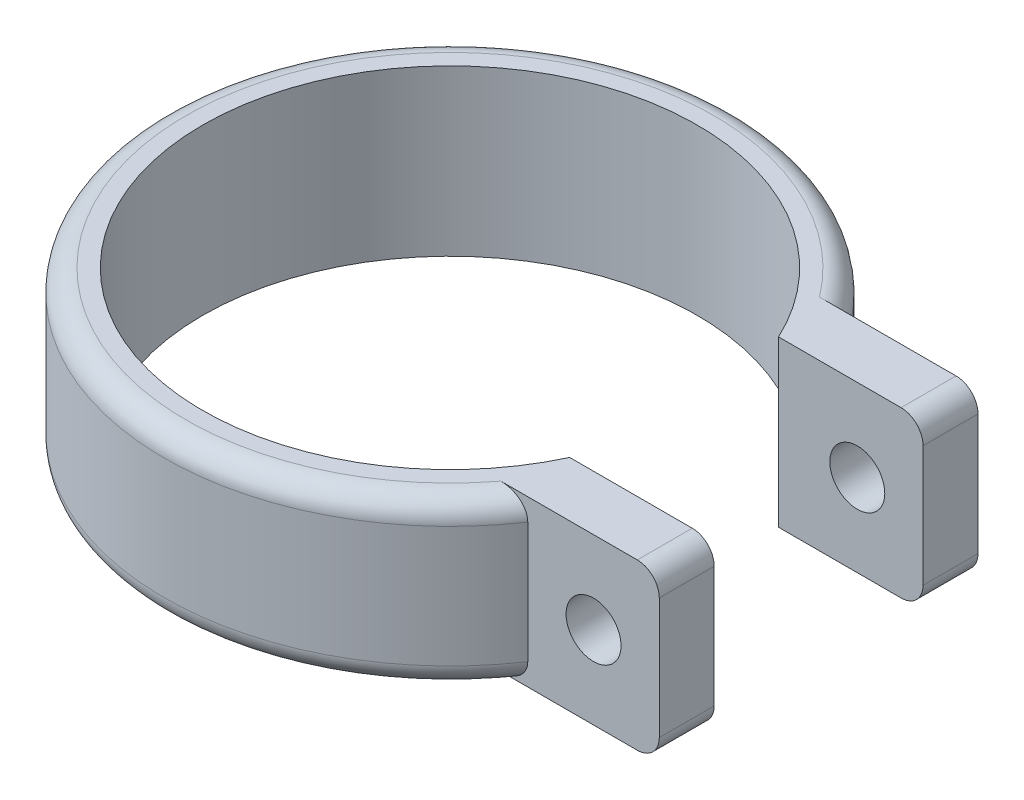
ISO-10303-21;
HEADER;
FILE_DESCRIPTION(('STEP AP214'),'2;1');
FILE_NAME('part.step','',(''),(''),'','','');
FILE_SCHEMA(('AUTOMOTIVE_DESIGN { 1 0 10303 214 1 1 1 1 }'));
ENDSEC;
DATA;
#1=APPLICATION_CONTEXT('core data for automotive mechanical design processes');
#2=APPLICATION_PROTOCOL_DEFINITION('international standard','automotive_design',2000,#1);
#3=PRODUCT_CONTEXT('',#1,'mechanical');
#4=PRODUCT('Part','Part','',(#3));
#5=PRODUCT_RELATED_PRODUCT_CATEGORY('part','',(#4));
#6=PRODUCT_DEFINITION_FORMATION('','',#4);
#7=PRODUCT_DEFINITION_CONTEXT('part definition',#1,'design');
#8=PRODUCT_DEFINITION('design','',#6,#7);
#9=PRODUCT_DEFINITION_SHAPE('','',#8);
#10=(LENGTH_UNIT() NAMED_UNIT(*) SI_UNIT(.MILLI.,.METRE.));
#11=(NAMED_UNIT(*) PLANE_ANGLE_UNIT() SI_UNIT($,.RADIAN.));
#12=(NAMED_UNIT(*) SI_UNIT($,.STERADIAN.) SOLID_ANGLE_UNIT());
#13=UNCERTAINTY_MEASURE_WITH_UNIT(LENGTH_MEASURE(1.E-05),#10,'distance_accuracy_value','');
#14=(GEOMETRIC_REPRESENTATION_CONTEXT(3) GLOBAL_UNCERTAINTY_ASSIGNED_CONTEXT((#13)) GLOBAL_UNIT_ASSIGNED_CONTEXT((#10,
#11,#12)) REPRESENTATION_CONTEXT('',''));
#15=CARTESIAN_POINT('',(0.,0.,0.));
#16=DIRECTION('',(0.,0.,1.));
#17=DIRECTION('',(1.,0.,0.));
#18=AXIS2_PLACEMENT_3D('',#15,#16,#17);
#19=CARTESIAN_POINT('',(33.5473122354776,15.,-9.5));
#20=DIRECTION('',(-1.,0.,0.));
#21=DIRECTION('',(0.,0.,1.));
#22=AXIS2_PLACEMENT_3D('',#19,#20,#21);
#23=PLANE('',#22);
#24=DIRECTION('',(0.,-1.,0.));
#25=VECTOR('',#24,1.);
#26=CARTESIAN_POINT('',(33.5473122354776,15.,-9.5));
#27=LINE('',#26,#25);
#28=CARTESIAN_POINT('',(33.5473122354776,13.,-9.5));
#29=VERTEX_POINT('',#28);
#30=CARTESIAN_POINT('',(33.5473122354776,2.,-9.5));
#31=VERTEX_POINT('',#30);
#32=EDGE_CURVE('E167',#29,#31,#27,.T.);
#33=ORIENTED_EDGE('',*,*,#32,.T.);
#34=DIRECTION('',(0.,0.,-1.));
#35=VECTOR('',#34,1.);
#36=CARTESIAN_POINT('',(33.5473122354776,2.,-9.5));
#37=LINE('',#36,#35);
#38=CARTESIAN_POINT('',(33.5473122354776,2.,-14.5));
#39=VERTEX_POINT('',#38);
#40=EDGE_CURVE('E218',#31,#39,#37,.T.);
#41=ORIENTED_EDGE('',*,*,#40,.T.);
#42=DIRECTION('',(0.,-1.,0.));
#43=VECTOR('',#42,1.);
#44=CARTESIAN_POINT('',(33.5473122354776,15.,-14.5));
#45=LINE('',#44,#43);
#46=CARTESIAN_POINT('',(33.5473122354776,13.,-14.5));
#47=VERTEX_POINT('',#46);
#48=EDGE_CURVE('E194',#47,#39,#45,.T.);
#49=ORIENTED_EDGE('',*,*,#48,.F.);
#50=DIRECTION('',(0.,0.,-1.));
#51=VECTOR('',#50,1.);
#52=CARTESIAN_POINT('',(33.5473122354776,13.,-9.5));
#53=LINE('',#52,#51);
#54=EDGE_CURVE('E216',#47,#29,#53,.F.);
#55=ORIENTED_EDGE('',*,*,#54,.T.);
#56=EDGE_LOOP('',(#33,#41,#49,#55));
#57=FACE_BOUND('',#56,.T.);
#58=ADVANCED_FACE('F36',(#57),#23,.F.);
#59=CARTESIAN_POINT('',(33.5473122354776,15.,-14.5));
#60=DIRECTION('',(0.,0.,1.));
#61=DIRECTION('',(1.,0.,0.));
#62=AXIS2_PLACEMENT_3D('',#59,#60,#61);
#63=PLANE('',#62);
#64=CARTESIAN_POINT('',(27.5642770451924,7.5,-14.5));
#65=DIRECTION('',(0.,0.,1.));
#66=DIRECTION('',(1.,0.,0.));
#67=AXIS2_PLACEMENT_3D('',#64,#65,#66);
#68=CIRCLE('',#67,2.5);
#69=CARTESIAN_POINT('',(30.0642770451924,7.5,-14.5));
#70=VERTEX_POINT('',#69);
#71=EDGE_CURVE('E174',#70,#70,#68,.T.);
#72=ORIENTED_EDGE('',*,*,#71,.T.);
#73=EDGE_LOOP('',(#72));
#74=FACE_BOUND('',#73,.T.);
#75=ORIENTED_EDGE('',*,*,#48,.T.);
#76=CARTESIAN_POINT('',(31.5473122354776,2.,-14.5));
#77=DIRECTION('',(0.,0.,1.));
#78=DIRECTION('',(1.,0.,0.));
#79=AXIS2_PLACEMENT_3D('',#76,#77,#78);
#80=CIRCLE('',#79,2.);
#81=CARTESIAN_POINT('',(31.5473122354776,0.,-14.5));
#82=VERTEX_POINT('',#81);
#83=EDGE_CURVE('E223',#39,#82,#80,.F.);
#84=ORIENTED_EDGE('',*,*,#83,.T.);
#85=DIRECTION('',(-1.,0.,0.));
#86=VECTOR('',#85,1.);
#87=CARTESIAN_POINT('',(33.5473122354776,0.,-14.5));
#88=LINE('',#87,#86);
#89=CARTESIAN_POINT('',(19.1245914989053,0.,-14.5));
#90=VERTEX_POINT('',#89);
#91=EDGE_CURVE('E171',#82,#90,#88,.T.);
#92=ORIENTED_EDGE('',*,*,#91,.T.);
#93=CARTESIAN_POINT('',(19.1245914989053,0.,-14.5));
#94=CARTESIAN_POINT('',(19.2936413375081,8.69825305665832E-06,-14.5));
#95=CARTESIAN_POINT('',(19.4631277610717,0.0136264284760047,-14.5));
#96=CARTESIAN_POINT('',(19.7983868128576,0.0693512299959271,-14.5));
#97=CARTESIAN_POINT('',(19.9641295146833,0.111636286901858,-14.5));
#98=CARTESIAN_POINT('',(20.2540565742359,0.214950087227459,-14.5));
#99=CARTESIAN_POINT('',(20.3800840610994,0.270780158488233,-14.5));
#100=CARTESIAN_POINT('',(20.6211294998245,0.402158003321633,-14.5));
#101=CARTESIAN_POINT('',(20.7361782615013,0.477648239000448,-14.5));
#102=CARTESIAN_POINT('',(20.9327189190862,0.633810739443377,-14.5));
#103=CARTESIAN_POINT('',(21.0165990723592,0.711468957257789,-14.5));
#104=CARTESIAN_POINT('',(21.1705210184579,0.879612413151045,-14.5));
#105=CARTESIAN_POINT('',(21.2405592579776,0.970100934637346,-14.5));
#106=CARTESIAN_POINT('',(21.363789331003,1.16309604843582,-14.5));
#107=CARTESIAN_POINT('',(21.4168480732013,1.26568935309437,-14.5));
#108=CARTESIAN_POINT('',(21.4806689050926,1.42563040242777,-14.5));
#109=CARTESIAN_POINT('',(21.4993110159743,1.47993333400015,-14.5));
#110=CARTESIAN_POINT('',(21.5310676637447,1.59012201195215,-14.5));
#111=CARTESIAN_POINT('',(21.5441855171411,1.64600678709573,-14.5));
#112=CARTESIAN_POINT('',(21.5633171218232,1.75150199722526,-14.5));
#113=CARTESIAN_POINT('',(21.5700312685346,1.80098686311791,-14.5));
#114=CARTESIAN_POINT('',(21.5789966352239,1.90031157715789,-14.5));
#115=CARTESIAN_POINT('',(21.5812520485859,1.95015104747767,-14.5));
#116=CARTESIAN_POINT('',(21.5812418549072,2.,-14.5));
#117=B_SPLINE_CURVE_WITH_KNOTS('',3,(#93,#94,#95,#96,#97,#98,#99,#100,#101,#102,#103,#104,#105,
#106,#107,#108,#109,#110,#111,#112,#113,#114,#115,#116),.UNSPECIFIED.,.F.,.F.,(4,2,2,2,2,2,2,2,
2,2,2,4),(0.,0.507334378331602,1.01784782257652,1.42974389775541,1.84044779620607,
2.18198112251818,2.52360200902193,2.86783853526572,3.03984121582224,3.21174048623355,
3.3613600630725,3.51083885746047),.UNSPECIFIED.);
#118=CARTESIAN_POINT('',(21.5812418549072,2.,-14.5));
#119=VERTEX_POINT('',#118);
#120=EDGE_CURVE('E249',#90,#119,#117,.T.);
#121=ORIENTED_EDGE('',*,*,#120,.T.);
#122=DIRECTION('',(0.,-1.,0.));
#123=VECTOR('',#122,1.);
#124=CARTESIAN_POINT('',(21.5812418549072,15.,-14.5));
#125=LINE('',#124,#123);
#126=CARTESIAN_POINT('',(21.5812418549072,13.,-14.5));
#127=VERTEX_POINT('',#126);
#128=EDGE_CURVE('E191',#127,#119,#125,.T.);
#129=ORIENTED_EDGE('',*,*,#128,.F.);
#130=CARTESIAN_POINT('',(21.5812418549072,13.,-14.5));
#131=CARTESIAN_POINT('',(21.5812525500746,13.0492968800028,-14.5));
#132=CARTESIAN_POINT('',(21.5790463329122,13.0985883969587,-14.5));
#133=CARTESIAN_POINT('',(21.5702820117545,13.1967644295305,-14.5));
#134=CARTESIAN_POINT('',(21.563725594606,13.2456490954716,-14.5));
#135=CARTESIAN_POINT('',(21.5463850895291,13.3424173601148,-14.5));
#136=CARTESIAN_POINT('',(21.5356217792218,13.3903046787,-14.5));
#137=CARTESIAN_POINT('',(21.510027352005,13.4849679647644,-14.5));
#138=CARTESIAN_POINT('',(21.4951960161254,13.5317438722722,-14.5));
#139=CARTESIAN_POINT('',(21.4449114455271,13.6698144300531,-14.5));
#140=CARTESIAN_POINT('',(21.4036308120417,13.7590522628015,-14.5));
#141=CARTESIAN_POINT('',(21.3074853085682,13.9298632480218,-14.5));
#142=CARTESIAN_POINT('',(21.2526069835422,14.0114286976425,-14.5));
#143=CARTESIAN_POINT('',(21.1279036365924,14.1700653889252,-14.5));
#144=CARTESIAN_POINT('',(21.0573926317439,14.2465955550924,-14.5));
#145=CARTESIAN_POINT('',(20.9061395904074,14.3886922473937,-14.5));
#146=CARTESIAN_POINT('',(20.8253946748786,14.4542556762381,-14.5));
#147=CARTESIAN_POINT('',(20.6423884648797,14.5836812191054,-14.5));
#148=CARTESIAN_POINT('',(20.5387512870901,14.6455944461883,-14.5));
#149=CARTESIAN_POINT('',(20.3237901731422,14.7542649040706,-14.5));
#150=CARTESIAN_POINT('',(20.2124588220382,14.8010072603875,-14.5));
#151=CARTESIAN_POINT('',(19.9636235800414,14.8868788486306,-14.5));
#152=CARTESIAN_POINT('',(19.8250852381367,14.9230046209588,-14.5));
#153=CARTESIAN_POINT('',(19.5444454944623,14.9750199736067,-14.5));
#154=CARTESIAN_POINT('',(19.4023480454246,14.9909310694057,-14.5));
#155=CARTESIAN_POINT('',(19.2148392829702,14.9990303879465,-14.5));
#156=CARTESIAN_POINT('',(19.1697064051486,14.999999555181,-14.5));
#157=CARTESIAN_POINT('',(19.1245914989053,15.,-14.5));
#158=B_SPLINE_CURVE_WITH_KNOTS('',3,(#130,#131,#132,#133,#134,#135,#136,#137,#138,#139,#140,
#141,#142,#143,#144,#145,#146,#147,#148,#149,#150,#151,#152,#153,#154,#155,#156,#157),
.UNSPECIFIED.,.F.,.F.,(4,2,2,2,2,2,2,2,2,2,2,2,2,4),(0.,0.147832371466264,0.295607452473689,
0.442661719898438,0.589723904388314,0.883245022394847,1.17705775025786,1.48803814821605,
1.79910622730861,2.15992123152113,2.5210889403756,2.94900412945992,3.37646348465335,
3.51184454973519),.UNSPECIFIED.);
#159=CARTESIAN_POINT('',(19.1245914989053,15.,-14.5));
#160=VERTEX_POINT('',#159);
#161=EDGE_CURVE('E11',#127,#160,#158,.T.);
#162=ORIENTED_EDGE('',*,*,#161,.T.);
#163=DIRECTION('',(-1.,0.,0.));
#164=VECTOR('',#163,1.);
#165=CARTESIAN_POINT('',(33.5473122354776,15.,-14.5));
#166=LINE('',#165,#164);
#167=CARTESIAN_POINT('',(31.5473122354776,15.,-14.5));
#168=VERTEX_POINT('',#167);
#169=EDGE_CURVE('E181',#168,#160,#166,.T.);
#170=ORIENTED_EDGE('',*,*,#169,.F.);
#171=CARTESIAN_POINT('',(31.5473122354776,13.,-14.5));
#172=DIRECTION('',(0.,0.,1.));
#173=DIRECTION('',(1.,0.,0.));
#174=AXIS2_PLACEMENT_3D('',#171,#172,#173);
#175=CIRCLE('',#174,2.);
#176=EDGE_CURVE('E221',#168,#47,#175,.F.);
#177=ORIENTED_EDGE('',*,*,#176,.T.);
#178=EDGE_LOOP('',(#75,#84,#92,#121,#129,#162,#170,#177));
#179=FACE_BOUND('',#178,.T.);
#180=ADVANCED_FACE('F301',(#74,#179),#63,.F.);
#181=CARTESIAN_POINT('',(0.,15.,0.));
#182=DIRECTION('',(0.,-1.,0.));
#183=DIRECTION('',(0.,0.,-1.));
#184=AXIS2_PLACEMENT_3D('',#181,#182,#183);
#185=CYLINDRICAL_SURFACE('',#184,26.);
#186=ORIENTED_EDGE('',*,*,#128,.T.);
#187=CARTESIAN_POINT('',(0.,2.,0.));
#188=DIRECTION('',(0.,1.,0.));
#189=DIRECTION('',(0.,0.,1.));
#190=AXIS2_PLACEMENT_3D('',#187,#188,#189);
#191=CIRCLE('',#190,26.);
#192=CARTESIAN_POINT('',(21.5812418549072,2.,14.5));
#193=VERTEX_POINT('',#192);
#194=EDGE_CURVE('E199',#119,#193,#191,.T.);
#195=ORIENTED_EDGE('',*,*,#194,.T.);
#196=DIRECTION('',(0.,-1.,0.));
#197=VECTOR('',#196,1.);
#198=CARTESIAN_POINT('',(21.5812418549072,15.,14.5));
#199=LINE('',#198,#197);
#200=CARTESIAN_POINT('',(21.5812418549072,13.,14.5));
#201=VERTEX_POINT('',#200);
#202=EDGE_CURVE('E188',#201,#193,#199,.T.);
#203=ORIENTED_EDGE('',*,*,#202,.F.);
#204=CARTESIAN_POINT('',(0.,13.,0.));
#205=DIRECTION('',(0.,1.,0.));
#206=DIRECTION('',(0.,0.,1.));
#207=AXIS2_PLACEMENT_3D('',#204,#205,#206);
#208=CIRCLE('',#207,26.);
#209=EDGE_CURVE('E197',#201,#127,#208,.F.);
#210=ORIENTED_EDGE('',*,*,#209,.T.);
#211=EDGE_LOOP('',(#186,#195,#203,#210));
#212=FACE_BOUND('',#211,.T.);
#213=ADVANCED_FACE('F266',(#212),#185,.T.);
#214=CARTESIAN_POINT('',(33.5473122354776,15.,14.5));
#215=DIRECTION('',(0.,0.,1.));
#216=DIRECTION('',(1.,0.,0.));
#217=AXIS2_PLACEMENT_3D('',#214,#215,#216);
#218=PLANE('',#217);
#219=CARTESIAN_POINT('',(27.5642770451924,7.5,14.5));
#220=DIRECTION('',(0.,0.,1.));
#221=DIRECTION('',(1.,0.,0.));
#222=AXIS2_PLACEMENT_3D('',#219,#220,#221);
#223=CIRCLE('',#222,2.5);
#224=CARTESIAN_POINT('',(30.0642770451924,7.5,14.5));
#225=VERTEX_POINT('',#224);
#226=EDGE_CURVE('E341',#225,#225,#223,.T.);
#227=ORIENTED_EDGE('',*,*,#226,.F.);
#228=EDGE_LOOP('',(#227));
#229=FACE_BOUND('',#228,.T.);
#230=DIRECTION('',(-1.,0.,0.));
#231=VECTOR('',#230,1.);
#232=CARTESIAN_POINT('',(33.5473122354776,0.,14.5));
#233=LINE('',#232,#231);
#234=CARTESIAN_POINT('',(31.5473122354776,0.,14.5));
#235=VERTEX_POINT('',#234);
#236=CARTESIAN_POINT('',(19.1245914989053,0.,14.5));
#237=VERTEX_POINT('',#236);
#238=EDGE_CURVE('E173',#235,#237,#233,.T.);
#239=ORIENTED_EDGE('',*,*,#238,.F.);
#240=CARTESIAN_POINT('',(31.5473122354776,2.,14.5));
#241=DIRECTION('',(0.,0.,1.));
#242=DIRECTION('',(1.,0.,0.));
#243=AXIS2_PLACEMENT_3D('',#240,#241,#242);
#244=CIRCLE('',#243,2.);
#245=CARTESIAN_POINT('',(33.5473122354776,2.,14.5));
#246=VERTEX_POINT('',#245);
#247=EDGE_CURVE('E231',#235,#246,#244,.T.);
#248=ORIENTED_EDGE('',*,*,#247,.T.);
#249=DIRECTION('',(0.,-1.,0.));
#250=VECTOR('',#249,1.);
#251=CARTESIAN_POINT('',(33.5473122354776,15.,14.5));
#252=LINE('',#251,#250);
#253=CARTESIAN_POINT('',(33.5473122354776,13.,14.5));
#254=VERTEX_POINT('',#253);
#255=EDGE_CURVE('E186',#254,#246,#252,.T.);
#256=ORIENTED_EDGE('',*,*,#255,.F.);
#257=CARTESIAN_POINT('',(31.5473122354776,13.,14.5));
#258=DIRECTION('',(0.,0.,1.));
#259=DIRECTION('',(1.,0.,0.));
#260=AXIS2_PLACEMENT_3D('',#257,#258,#259);
#261=CIRCLE('',#260,2.);
#262=CARTESIAN_POINT('',(31.5473122354776,15.,14.5));
#263=VERTEX_POINT('',#262);
#264=EDGE_CURVE('E229',#254,#263,#261,.T.);
#265=ORIENTED_EDGE('',*,*,#264,.T.);
#266=DIRECTION('',(-1.,0.,0.));
#267=VECTOR('',#266,1.);
#268=CARTESIAN_POINT('',(33.5473122354776,15.,14.5));
#269=LINE('',#268,#267);
#270=CARTESIAN_POINT('',(19.1245914989053,15.,14.5));
#271=VERTEX_POINT('',#270);
#272=EDGE_CURVE('E160',#263,#271,#269,.T.);
#273=ORIENTED_EDGE('',*,*,#272,.T.);
#274=CARTESIAN_POINT('',(19.1245914989053,15.,14.5));
#275=CARTESIAN_POINT('',(19.2936413375081,14.9999913017469,14.5));
#276=CARTESIAN_POINT('',(19.4631277610717,14.986373571524,14.5));
#277=CARTESIAN_POINT('',(19.7983868128576,14.9306487700041,14.5));
#278=CARTESIAN_POINT('',(19.9641295146833,14.8883637130981,14.5));
#279=CARTESIAN_POINT('',(20.2540565742359,14.7850499127725,14.5));
#280=CARTESIAN_POINT('',(20.3800840610994,14.7292198415118,14.5));
#281=CARTESIAN_POINT('',(20.6211294998246,14.5978419966784,14.5));
#282=CARTESIAN_POINT('',(20.7361782615014,14.5223517609995,14.5));
#283=CARTESIAN_POINT('',(20.9327189190862,14.3661892605566,14.5));
#284=CARTESIAN_POINT('',(21.0165990723592,14.2885310427422,14.5));
#285=CARTESIAN_POINT('',(21.170521018458,14.1203875868489,14.5));
#286=CARTESIAN_POINT('',(21.2405592579776,14.0298990653626,14.5));
#287=CARTESIAN_POINT('',(21.363789331003,13.8369039515642,14.5));
#288=CARTESIAN_POINT('',(21.4168480732013,13.7343106469056,14.5));
#289=CARTESIAN_POINT('',(21.4806689050926,13.5743695975722,14.5));
#290=CARTESIAN_POINT('',(21.4993110159743,13.5200666659998,14.5));
#291=CARTESIAN_POINT('',(21.5310676637447,13.4098779880478,14.5));
#292=CARTESIAN_POINT('',(21.5441855171411,13.3539932129043,14.5));
#293=CARTESIAN_POINT('',(21.5633171218232,13.2484980027747,14.5));
#294=CARTESIAN_POINT('',(21.5700312685347,13.1990131368821,14.5));
#295=CARTESIAN_POINT('',(21.5789966352239,13.0996884228421,14.5));
#296=CARTESIAN_POINT('',(21.5812520485859,13.0498489525223,14.5));
#297=CARTESIAN_POINT('',(21.5812418549072,13.,14.5));
#298=B_SPLINE_CURVE_WITH_KNOTS('',3,(#274,#275,#276,#277,#278,#279,#280,#281,#282,#283,#284,
#285,#286,#287,#288,#289,#290,#291,#292,#293,#294,#295,#296,#297),.UNSPECIFIED.,.F.,.F.,(4,2,2,
2,2,2,2,2,2,2,2,4),(0.,0.507334378331605,1.01784782257652,1.42974389775542,1.84044779620608,
2.18198112251819,2.52360200902194,2.86783853526572,3.03984121582225,3.21174048623355,
3.3613600630725,3.51083885746047),.UNSPECIFIED.);
#299=EDGE_CURVE('E45',#271,#201,#298,.T.);
#300=ORIENTED_EDGE('',*,*,#299,.T.);
#301=ORIENTED_EDGE('',*,*,#202,.T.);
#302=CARTESIAN_POINT('',(21.5812418549072,2.,14.5));
#303=CARTESIAN_POINT('',(21.5812525500746,1.95070311999719,14.5));
#304=CARTESIAN_POINT('',(21.5790463329122,1.90141160304134,14.5));
#305=CARTESIAN_POINT('',(21.5702820117545,1.80323557046948,14.5));
#306=CARTESIAN_POINT('',(21.563725594606,1.75435090452838,14.5));
#307=CARTESIAN_POINT('',(21.5463850895291,1.65758263988519,14.5));
#308=CARTESIAN_POINT('',(21.5356217792218,1.60969532130004,14.5));
#309=CARTESIAN_POINT('',(21.5100273520051,1.51503203523563,14.5));
#310=CARTESIAN_POINT('',(21.4951960161254,1.46825612772776,14.5));
#311=CARTESIAN_POINT('',(21.4449114455271,1.3301855699469,14.5));
#312=CARTESIAN_POINT('',(21.4036308120417,1.24094773719855,14.5));
#313=CARTESIAN_POINT('',(21.3074853085682,1.07013675197822,14.5));
#314=CARTESIAN_POINT('',(21.2526069835422,0.988571302357462,14.5));
#315=CARTESIAN_POINT('',(21.1279036365924,0.829934611074798,14.5));
#316=CARTESIAN_POINT('',(21.0573926317439,0.753404444907594,14.5));
#317=CARTESIAN_POINT('',(20.9061395904075,0.611307752606332,14.5));
#318=CARTESIAN_POINT('',(20.8253946748786,0.545744323761882,14.5));
#319=CARTESIAN_POINT('',(20.6423884648797,0.41631878089462,14.5));
#320=CARTESIAN_POINT('',(20.5387512870901,0.354405553811706,14.5));
#321=CARTESIAN_POINT('',(20.3237901731422,0.24573509592936,14.5));
#322=CARTESIAN_POINT('',(20.2124588220382,0.198992739612448,14.5));
#323=CARTESIAN_POINT('',(19.9636235800414,0.11312115136938,14.5));
#324=CARTESIAN_POINT('',(19.8250852381367,0.0769953790411505,14.5));
#325=CARTESIAN_POINT('',(19.5444454944623,0.0249800263932527,14.5));
#326=CARTESIAN_POINT('',(19.4023480454246,0.00906893059426731,14.5));
#327=CARTESIAN_POINT('',(19.2148392829702,0.00096961205352357,14.5));
#328=CARTESIAN_POINT('',(19.1697064051486,4.44819040089942E-07,14.5));
#329=CARTESIAN_POINT('',(19.1245914989053,0.,14.5));
#330=B_SPLINE_CURVE_WITH_KNOTS('',3,(#302,#303,#304,#305,#306,#307,#308,#309,#310,#311,#312,
#313,#314,#315,#316,#317,#318,#319,#320,#321,#322,#323,#324,#325,#326,#327,#328,#329),
.UNSPECIFIED.,.F.,.F.,(4,2,2,2,2,2,2,2,2,2,2,2,2,4),(0.,0.147832371466262,0.295607452473688,
0.442661719898436,0.589723904388312,0.883245022394845,1.17705775025786,1.48803814821604,
1.79910622730861,2.15992123152114,2.52108894037561,2.94900412945992,3.37646348465335,
3.51184454973519),.UNSPECIFIED.);
#331=EDGE_CURVE('E240',#193,#237,#330,.T.);
#332=ORIENTED_EDGE('',*,*,#331,.T.);
#333=EDGE_LOOP('',(#239,#248,#256,#265,#273,#300,#301,#332));
#334=FACE_BOUND('',#333,.T.);
#335=ADVANCED_FACE('F260',(#229,#334),#218,.T.);
#336=CARTESIAN_POINT('',(33.5473122354776,15.,9.5));
#337=DIRECTION('',(1.,0.,0.));
#338=DIRECTION('',(0.,0.,-1.));
#339=AXIS2_PLACEMENT_3D('',#336,#337,#338);
#340=PLANE('',#339);
#341=ORIENTED_EDGE('',*,*,#255,.T.);
#342=DIRECTION('',(0.,0.,1.));
#343=VECTOR('',#342,1.);
#344=CARTESIAN_POINT('',(33.5473122354776,2.,9.5));
#345=LINE('',#344,#343);
#346=CARTESIAN_POINT('',(33.5473122354776,2.,9.5));
#347=VERTEX_POINT('',#346);
#348=EDGE_CURVE('E52',#246,#347,#345,.F.);
#349=ORIENTED_EDGE('',*,*,#348,.T.);
#350=DIRECTION('',(0.,-1.,0.));
#351=VECTOR('',#350,1.);
#352=CARTESIAN_POINT('',(33.5473122354776,15.,9.5));
#353=LINE('',#352,#351);
#354=CARTESIAN_POINT('',(33.5473122354776,13.,9.5));
#355=VERTEX_POINT('',#354);
#356=EDGE_CURVE('E148',#355,#347,#353,.T.);
#357=ORIENTED_EDGE('',*,*,#356,.F.);
#358=DIRECTION('',(0.,0.,1.));
#359=VECTOR('',#358,1.);
#360=CARTESIAN_POINT('',(33.5473122354776,13.,9.5));
#361=LINE('',#360,#359);
#362=EDGE_CURVE('E233',#355,#254,#361,.T.);
#363=ORIENTED_EDGE('',*,*,#362,.T.);
#364=EDGE_LOOP('',(#341,#349,#357,#363));
#365=FACE_BOUND('',#364,.T.);
#366=ADVANCED_FACE('F265',(#365),#340,.T.);
#367=CARTESIAN_POINT('',(20.3960780543711,15.,9.5));
#368=DIRECTION('',(0.,0.,-1.));
#369=DIRECTION('',(-1.,0.,0.));
#370=AXIS2_PLACEMENT_3D('',#367,#368,#369);
#371=PLANE('',#370);
#372=CARTESIAN_POINT('',(27.5642770451924,7.5,9.49999999999999));
#373=DIRECTION('',(0.,0.,-1.));
#374=DIRECTION('',(-1.,0.,0.));
#375=AXIS2_PLACEMENT_3D('',#372,#373,#374);
#376=CIRCLE('',#375,2.5);
#377=CARTESIAN_POINT('',(25.0642770451924,7.5,9.49999999999999));
#378=VERTEX_POINT('',#377);
#379=EDGE_CURVE('E338',#378,#378,#376,.T.);
#380=ORIENTED_EDGE('',*,*,#379,.F.);
#381=EDGE_LOOP('',(#380));
#382=FACE_BOUND('',#381,.T.);
#383=ORIENTED_EDGE('',*,*,#356,.T.);
#384=CARTESIAN_POINT('',(31.5473122354776,2.,9.5));
#385=DIRECTION('',(0.,0.,-1.));
#386=DIRECTION('',(-1.,0.,0.));
#387=AXIS2_PLACEMENT_3D('',#384,#385,#386);
#388=CIRCLE('',#387,2.);
#389=CARTESIAN_POINT('',(31.5473122354776,0.,9.5));
#390=VERTEX_POINT('',#389);
#391=EDGE_CURVE('E238',#347,#390,#388,.T.);
#392=ORIENTED_EDGE('',*,*,#391,.T.);
#393=DIRECTION('',(1.,0.,0.));
#394=VECTOR('',#393,1.);
#395=CARTESIAN_POINT('',(20.3960780543711,0.,9.5));
#396=LINE('',#395,#394);
#397=CARTESIAN_POINT('',(20.3960780543711,0.,9.49999999999999));
#398=VERTEX_POINT('',#397);
#399=EDGE_CURVE('E143',#398,#390,#396,.T.);
#400=ORIENTED_EDGE('',*,*,#399,.F.);
#401=DIRECTION('',(0.,-1.,0.));
#402=VECTOR('',#401,1.);
#403=CARTESIAN_POINT('',(20.3960780543711,15.,9.49999999999999));
#404=LINE('',#403,#402);
#405=CARTESIAN_POINT('',(20.3960780543711,15.,9.49999999999999));
#406=VERTEX_POINT('',#405);
#407=EDGE_CURVE('E138',#406,#398,#404,.T.);
#408=ORIENTED_EDGE('',*,*,#407,.F.);
#409=DIRECTION('',(1.,0.,0.));
#410=VECTOR('',#409,1.);
#411=CARTESIAN_POINT('',(20.3960780543711,15.,9.5));
#412=LINE('',#411,#410);
#413=CARTESIAN_POINT('',(31.5473122354776,15.,9.5));
#414=VERTEX_POINT('',#413);
#415=EDGE_CURVE('E141',#406,#414,#412,.T.);
#416=ORIENTED_EDGE('',*,*,#415,.T.);
#417=CARTESIAN_POINT('',(31.5473122354776,13.,9.5));
#418=DIRECTION('',(0.,0.,-1.));
#419=DIRECTION('',(-1.,0.,0.));
#420=AXIS2_PLACEMENT_3D('',#417,#418,#419);
#421=CIRCLE('',#420,2.);
#422=EDGE_CURVE('E59',#414,#355,#421,.T.);
#423=ORIENTED_EDGE('',*,*,#422,.T.);
#424=EDGE_LOOP('',(#383,#392,#400,#408,#416,#423));
#425=FACE_BOUND('',#424,.T.);
#426=ADVANCED_FACE('F140',(#382,#425),#371,.T.);
#427=CARTESIAN_POINT('',(0.,15.,0.));
#428=DIRECTION('',(0.,-1.,0.));
#429=DIRECTION('',(0.,0.,-1.));
#430=AXIS2_PLACEMENT_3D('',#427,#428,#429);
#431=CYLINDRICAL_SURFACE('',#430,22.5);
#432=CARTESIAN_POINT('',(0.,0.,0.));
#433=DIRECTION('',(0.,1.,0.));
#434=DIRECTION('',(0.,0.,1.));
#435=AXIS2_PLACEMENT_3D('',#432,#433,#434);
#436=CIRCLE('',#435,22.5);
#437=CARTESIAN_POINT('',(20.3960780543711,0.,-9.5));
#438=VERTEX_POINT('',#437);
#439=EDGE_CURVE('E177',#438,#398,#436,.T.);
#440=ORIENTED_EDGE('',*,*,#439,.F.);
#441=DIRECTION('',(0.,-1.,0.));
#442=VECTOR('',#441,1.);
#443=CARTESIAN_POINT('',(20.3960780543711,15.,-9.5));
#444=LINE('',#443,#442);
#445=CARTESIAN_POINT('',(20.3960780543711,15.,-9.5));
#446=VERTEX_POINT('',#445);
#447=EDGE_CURVE('E149',#446,#438,#444,.T.);
#448=ORIENTED_EDGE('',*,*,#447,.F.);
#449=CARTESIAN_POINT('',(0.,15.,0.));
#450=DIRECTION('',(0.,1.,0.));
#451=DIRECTION('',(0.,0.,1.));
#452=AXIS2_PLACEMENT_3D('',#449,#450,#451);
#453=CIRCLE('',#452,22.5);
#454=EDGE_CURVE('E156',#446,#406,#453,.T.);
#455=ORIENTED_EDGE('',*,*,#454,.T.);
#456=ORIENTED_EDGE('',*,*,#407,.T.);
#457=EDGE_LOOP('',(#440,#448,#455,#456));
#458=FACE_BOUND('',#457,.T.);
#459=ADVANCED_FACE('F163',(#458),#431,.F.);
#460=CARTESIAN_POINT('',(33.5473122354776,15.,-9.5));
#461=DIRECTION('',(0.,0.,1.));
#462=DIRECTION('',(1.,0.,0.));
#463=AXIS2_PLACEMENT_3D('',#460,#461,#462);
#464=PLANE('',#463);
#465=CARTESIAN_POINT('',(27.5642770451924,7.5,-9.5));
#466=DIRECTION('',(0.,0.,1.));
#467=DIRECTION('',(1.,0.,0.));
#468=AXIS2_PLACEMENT_3D('',#465,#466,#467);
#469=CIRCLE('',#468,2.5);
#470=CARTESIAN_POINT('',(30.0642770451924,7.5,-9.5));
#471=VERTEX_POINT('',#470);
#472=EDGE_CURVE('E40',#471,#471,#469,.T.);
#473=ORIENTED_EDGE('',*,*,#472,.F.);
#474=EDGE_LOOP('',(#473));
#475=FACE_BOUND('',#474,.T.);
#476=DIRECTION('',(-1.,0.,0.));
#477=VECTOR('',#476,1.);
#478=CARTESIAN_POINT('',(33.5473122354776,0.,-9.5));
#479=LINE('',#478,#477);
#480=CARTESIAN_POINT('',(31.5473122354776,0.,-9.5));
#481=VERTEX_POINT('',#480);
#482=EDGE_CURVE('E179',#481,#438,#479,.T.);
#483=ORIENTED_EDGE('',*,*,#482,.F.);
#484=CARTESIAN_POINT('',(31.5473122354776,2.,-9.5));
#485=DIRECTION('',(0.,0.,1.));
#486=DIRECTION('',(1.,0.,0.));
#487=AXIS2_PLACEMENT_3D('',#484,#485,#486);
#488=CIRCLE('',#487,2.);
#489=EDGE_CURVE('E227',#481,#31,#488,.T.);
#490=ORIENTED_EDGE('',*,*,#489,.T.);
#491=ORIENTED_EDGE('',*,*,#32,.F.);
#492=CARTESIAN_POINT('',(31.5473122354776,13.,-9.5));
#493=DIRECTION('',(0.,0.,1.));
#494=DIRECTION('',(1.,0.,0.));
#495=AXIS2_PLACEMENT_3D('',#492,#493,#494);
#496=CIRCLE('',#495,2.);
#497=CARTESIAN_POINT('',(31.5473122354776,15.,-9.5));
#498=VERTEX_POINT('',#497);
#499=EDGE_CURVE('E225',#29,#498,#496,.T.);
#500=ORIENTED_EDGE('',*,*,#499,.T.);
#501=DIRECTION('',(-1.,0.,0.));
#502=VECTOR('',#501,1.);
#503=CARTESIAN_POINT('',(33.5473122354776,15.,-9.5));
#504=LINE('',#503,#502);
#505=EDGE_CURVE('E165',#498,#446,#504,.T.);
#506=ORIENTED_EDGE('',*,*,#505,.T.);
#507=ORIENTED_EDGE('',*,*,#447,.T.);
#508=EDGE_LOOP('',(#483,#490,#491,#500,#506,#507));
#509=FACE_BOUND('',#508,.T.);
#510=ADVANCED_FACE('F350',(#475,#509),#464,.T.);
#511=CARTESIAN_POINT('',(0.,15.,0.));
#512=DIRECTION('',(0.,1.,0.));
#513=DIRECTION('',(0.,0.,1.));
#514=AXIS2_PLACEMENT_3D('',#511,#512,#513);
#515=PLANE('',#514);
#516=CARTESIAN_POINT('',(0.,15.,0.));
#517=DIRECTION('',(0.,1.,0.));
#518=DIRECTION('',(0.,0.,1.));
#519=AXIS2_PLACEMENT_3D('',#516,#517,#518);
#520=CIRCLE('',#519,24.);
#521=EDGE_CURVE('E214',#160,#271,#520,.T.);
#522=ORIENTED_EDGE('',*,*,#521,.T.);
#523=ORIENTED_EDGE('',*,*,#272,.F.);
#524=DIRECTION('',(0.,0.,1.));
#525=VECTOR('',#524,1.);
#526=CARTESIAN_POINT('',(31.5473122354776,15.,0.));
#527=LINE('',#526,#525);
#528=EDGE_CURVE('E159',#263,#414,#527,.F.);
#529=ORIENTED_EDGE('',*,*,#528,.T.);
#530=ORIENTED_EDGE('',*,*,#415,.F.);
#531=ORIENTED_EDGE('',*,*,#454,.F.);
#532=ORIENTED_EDGE('',*,*,#505,.F.);
#533=DIRECTION('',(0.,0.,-1.));
#534=VECTOR('',#533,1.);
#535=CARTESIAN_POINT('',(31.5473122354776,15.,-14.5));
#536=LINE('',#535,#534);
#537=EDGE_CURVE('E211',#498,#168,#536,.T.);
#538=ORIENTED_EDGE('',*,*,#537,.T.);
#539=ORIENTED_EDGE('',*,*,#169,.T.);
#540=EDGE_LOOP('',(#522,#523,#529,#530,#531,#532,#538,#539));
#541=FACE_BOUND('',#540,.T.);
#542=ADVANCED_FACE('F154',(#541),#515,.T.);
#543=CARTESIAN_POINT('',(0.,0.,0.));
#544=DIRECTION('',(0.,1.,0.));
#545=DIRECTION('',(0.,0.,1.));
#546=AXIS2_PLACEMENT_3D('',#543,#544,#545);
#547=PLANE('',#546);
#548=ORIENTED_EDGE('',*,*,#238,.T.);
#549=CARTESIAN_POINT('',(0.,0.,0.));
#550=DIRECTION('',(0.,1.,0.));
#551=DIRECTION('',(0.,0.,1.));
#552=AXIS2_PLACEMENT_3D('',#549,#550,#551);
#553=CIRCLE('',#552,24.);
#554=EDGE_CURVE('E207',#237,#90,#553,.F.);
#555=ORIENTED_EDGE('',*,*,#554,.T.);
#556=ORIENTED_EDGE('',*,*,#91,.F.);
#557=DIRECTION('',(0.,0.,-1.));
#558=VECTOR('',#557,1.);
#559=CARTESIAN_POINT('',(31.5473122354776,0.,0.));
#560=LINE('',#559,#558);
#561=EDGE_CURVE('E205',#82,#481,#560,.F.);
#562=ORIENTED_EDGE('',*,*,#561,.T.);
#563=ORIENTED_EDGE('',*,*,#482,.T.);
#564=ORIENTED_EDGE('',*,*,#439,.T.);
#565=ORIENTED_EDGE('',*,*,#399,.T.);
#566=DIRECTION('',(0.,0.,1.));
#567=VECTOR('',#566,1.);
#568=CARTESIAN_POINT('',(31.5473122354776,0.,14.5));
#569=LINE('',#568,#567);
#570=EDGE_CURVE('E202',#390,#235,#569,.T.);
#571=ORIENTED_EDGE('',*,*,#570,.T.);
#572=EDGE_LOOP('',(#548,#555,#556,#562,#563,#564,#565,#571));
#573=FACE_BOUND('',#572,.T.);
#574=ADVANCED_FACE('F319',(#573),#547,.F.);
#575=CARTESIAN_POINT('',(0.,2.,0.));
#576=DIRECTION('',(0.,1.,0.));
#577=DIRECTION('',(0.,0.,1.));
#578=AXIS2_PLACEMENT_3D('',#575,#576,#577);
#579=TOROIDAL_SURFACE('',#578,24.,2.);
#580=ORIENTED_EDGE('',*,*,#120,.F.);
#581=ORIENTED_EDGE('',*,*,#554,.F.);
#582=ORIENTED_EDGE('',*,*,#331,.F.);
#583=ORIENTED_EDGE('',*,*,#194,.F.);
#584=EDGE_LOOP('',(#580,#581,#582,#583));
#585=FACE_BOUND('',#584,.T.);
#586=ADVANCED_FACE('F256',(#585),#579,.T.);
#587=CARTESIAN_POINT('',(0.,13.,0.));
#588=DIRECTION('',(0.,1.,0.));
#589=DIRECTION('',(0.,0.,1.));
#590=AXIS2_PLACEMENT_3D('',#587,#588,#589);
#591=TOROIDAL_SURFACE('',#590,24.,2.);
#592=ORIENTED_EDGE('',*,*,#161,.F.);
#593=ORIENTED_EDGE('',*,*,#209,.F.);
#594=ORIENTED_EDGE('',*,*,#299,.F.);
#595=ORIENTED_EDGE('',*,*,#521,.F.);
#596=EDGE_LOOP('',(#592,#593,#594,#595));
#597=FACE_BOUND('',#596,.T.);
#598=ADVANCED_FACE('F278',(#597),#591,.T.);
#599=CARTESIAN_POINT('',(31.5473122354776,2.,-9.5));
#600=DIRECTION('',(0.,0.,-1.));
#601=DIRECTION('',(-1.,0.,0.));
#602=AXIS2_PLACEMENT_3D('',#599,#600,#601);
#603=CYLINDRICAL_SURFACE('',#602,2.);
#604=ORIENTED_EDGE('',*,*,#489,.F.);
#605=ORIENTED_EDGE('',*,*,#561,.F.);
#606=ORIENTED_EDGE('',*,*,#83,.F.);
#607=ORIENTED_EDGE('',*,*,#40,.F.);
#608=EDGE_LOOP('',(#604,#605,#606,#607));
#609=FACE_BOUND('',#608,.T.);
#610=ADVANCED_FACE('F282',(#609),#603,.T.);
#611=CARTESIAN_POINT('',(31.5473122354776,2.,0.));
#612=DIRECTION('',(0.,0.,-1.));
#613=DIRECTION('',(-1.,0.,0.));
#614=AXIS2_PLACEMENT_3D('',#611,#612,#613);
#615=CYLINDRICAL_SURFACE('',#614,2.);
#616=ORIENTED_EDGE('',*,*,#391,.F.);
#617=ORIENTED_EDGE('',*,*,#348,.F.);
#618=ORIENTED_EDGE('',*,*,#247,.F.);
#619=ORIENTED_EDGE('',*,*,#570,.F.);
#620=EDGE_LOOP('',(#616,#617,#618,#619));
#621=FACE_BOUND('',#620,.T.);
#622=ADVANCED_FACE('F287',(#621),#615,.T.);
#623=CARTESIAN_POINT('',(31.5473122354776,13.,0.));
#624=DIRECTION('',(0.,0.,1.));
#625=DIRECTION('',(1.,0.,0.));
#626=AXIS2_PLACEMENT_3D('',#623,#624,#625);
#627=CYLINDRICAL_SURFACE('',#626,2.);
#628=ORIENTED_EDGE('',*,*,#499,.F.);
#629=ORIENTED_EDGE('',*,*,#54,.F.);
#630=ORIENTED_EDGE('',*,*,#176,.F.);
#631=ORIENTED_EDGE('',*,*,#537,.F.);
#632=EDGE_LOOP('',(#628,#629,#630,#631));
#633=FACE_BOUND('',#632,.T.);
#634=ADVANCED_FACE('F290',(#633),#627,.T.);
#635=CARTESIAN_POINT('',(31.5473122354776,13.,9.5));
#636=DIRECTION('',(0.,0.,1.));
#637=DIRECTION('',(1.,0.,0.));
#638=AXIS2_PLACEMENT_3D('',#635,#636,#637);
#639=CYLINDRICAL_SURFACE('',#638,2.);
#640=ORIENTED_EDGE('',*,*,#422,.F.);
#641=ORIENTED_EDGE('',*,*,#528,.F.);
#642=ORIENTED_EDGE('',*,*,#264,.F.);
#643=ORIENTED_EDGE('',*,*,#362,.F.);
#644=EDGE_LOOP('',(#640,#641,#642,#643));
#645=FACE_BOUND('',#644,.T.);
#646=ADVANCED_FACE('F38',(#645),#639,.T.);
#647=CARTESIAN_POINT('',(27.5642770451924,7.5,-58.5));
#648=DIRECTION('',(0.,0.,1.));
#649=DIRECTION('',(1.,0.,0.));
#650=AXIS2_PLACEMENT_3D('',#647,#648,#649);
#651=CYLINDRICAL_SURFACE('',#650,2.5);
#652=ORIENTED_EDGE('',*,*,#472,.T.);
#653=EDGE_LOOP('',(#652));
#654=FACE_BOUND('',#653,.T.);
#655=ORIENTED_EDGE('',*,*,#71,.F.);
#656=EDGE_LOOP('',(#655));
#657=FACE_BOUND('',#656,.T.);
#658=ADVANCED_FACE('F297',(#654,#657),#651,.F.);
#659=ORIENTED_EDGE('',*,*,#379,.T.);
#660=EDGE_LOOP('',(#659));
#661=FACE_BOUND('',#660,.T.);
#662=ORIENTED_EDGE('',*,*,#226,.T.);
#663=EDGE_LOOP('',(#662));
#664=FACE_BOUND('',#663,.T.);
#665=ADVANCED_FACE('F374',(#661,#664),#651,.F.);
#666=CLOSED_SHELL('',(#58,#180,#213,#335,#366,#426,#459,#510,#542,#574,#586,#598,#610,#622,#634,
#646,#658,#665));
#667=MANIFOLD_SOLID_BREP('B2',#666);
#668=ADVANCED_BREP_SHAPE_REPRESENTATION('',(#18,#667),#14);
#669=SHAPE_DEFINITION_REPRESENTATION(#9,#668);
ENDSEC;
END-ISO-10303-21;
